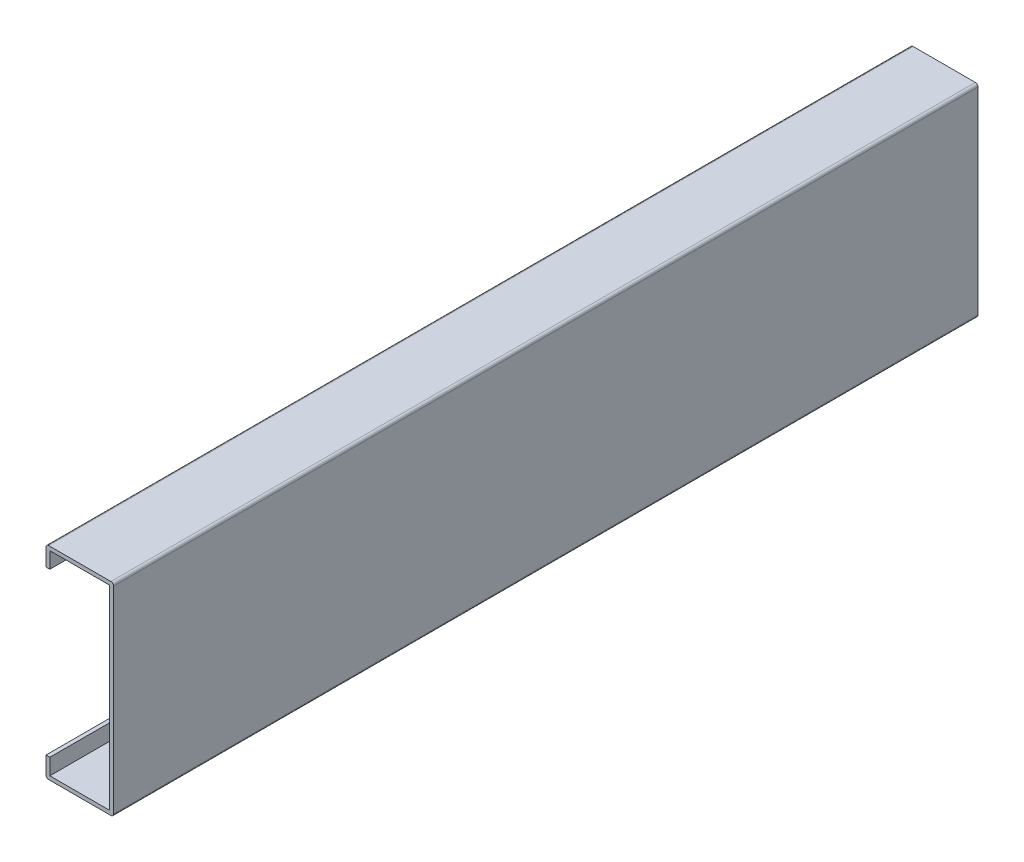
ISO-10303-21;
HEADER;
FILE_DESCRIPTION(('STEP AP214'),'2;1');
FILE_NAME('part.step','',(''),(''),'','','');
FILE_SCHEMA(('AUTOMOTIVE_DESIGN { 1 0 10303 214 1 1 1 1 }'));
ENDSEC;
DATA;
#1=APPLICATION_CONTEXT('core data for automotive mechanical design processes');
#2=APPLICATION_PROTOCOL_DEFINITION('international standard','automotive_design',2000,#1);
#3=PRODUCT_CONTEXT('',#1,'mechanical');
#4=PRODUCT('Part','Part','',(#3));
#5=PRODUCT_RELATED_PRODUCT_CATEGORY('part','',(#4));
#6=PRODUCT_DEFINITION_FORMATION('','',#4);
#7=PRODUCT_DEFINITION_CONTEXT('part definition',#1,'design');
#8=PRODUCT_DEFINITION('design','',#6,#7);
#9=PRODUCT_DEFINITION_SHAPE('','',#8);
#10=(LENGTH_UNIT() NAMED_UNIT(*) SI_UNIT(.MILLI.,.METRE.));
#11=(NAMED_UNIT(*) PLANE_ANGLE_UNIT() SI_UNIT($,.RADIAN.));
#12=(NAMED_UNIT(*) SI_UNIT($,.STERADIAN.) SOLID_ANGLE_UNIT());
#13=UNCERTAINTY_MEASURE_WITH_UNIT(LENGTH_MEASURE(1.E-05),#10,'distance_accuracy_value','');
#14=(GEOMETRIC_REPRESENTATION_CONTEXT(3) GLOBAL_UNCERTAINTY_ASSIGNED_CONTEXT((#13)) GLOBAL_UNIT_ASSIGNED_CONTEXT((#10,
#11,#12)) REPRESENTATION_CONTEXT('',''));
#15=CARTESIAN_POINT('',(0.,0.,0.));
#16=DIRECTION('',(0.,0.,1.));
#17=DIRECTION('',(1.,0.,0.));
#18=AXIS2_PLACEMENT_3D('',#15,#16,#17);
#19=CARTESIAN_POINT('',(0.,0.,650.));
#20=DIRECTION('',(1.,0.,0.));
#21=DIRECTION('',(0.,1.,0.));
#22=AXIS2_PLACEMENT_3D('',#19,#20,#21);
#23=PLANE('',#22);
#24=DIRECTION('',(0.,-1.,0.));
#25=VECTOR('',#24,1.);
#26=CARTESIAN_POINT('',(0.,0.,650.));
#27=LINE('',#26,#25);
#28=CARTESIAN_POINT('',(0.,-2.,650.));
#29=VERTEX_POINT('',#28);
#30=CARTESIAN_POINT('',(0.,-15.,650.));
#31=VERTEX_POINT('',#30);
#32=EDGE_CURVE('E147',#29,#31,#27,.T.);
#33=ORIENTED_EDGE('',*,*,#32,.F.);
#34=DIRECTION('',(0.,0.,-1.));
#35=VECTOR('',#34,1.);
#36=CARTESIAN_POINT('',(0.,-2.,650.));
#37=LINE('',#36,#35);
#38=CARTESIAN_POINT('',(0.,-2.,0.));
#39=VERTEX_POINT('',#38);
#40=EDGE_CURVE('E203',#29,#39,#37,.T.);
#41=ORIENTED_EDGE('',*,*,#40,.T.);
#42=DIRECTION('',(0.,-1.,0.));
#43=VECTOR('',#42,1.);
#44=CARTESIAN_POINT('',(0.,0.,0.));
#45=LINE('',#44,#43);
#46=CARTESIAN_POINT('',(0.,-15.,0.));
#47=VERTEX_POINT('',#46);
#48=EDGE_CURVE('E172',#39,#47,#45,.T.);
#49=ORIENTED_EDGE('',*,*,#48,.T.);
#50=DIRECTION('',(0.,0.,-1.));
#51=VECTOR('',#50,1.);
#52=CARTESIAN_POINT('',(0.,-15.,650.));
#53=LINE('',#52,#51);
#54=EDGE_CURVE('E165',#31,#47,#53,.T.);
#55=ORIENTED_EDGE('',*,*,#54,.F.);
#56=EDGE_LOOP('',(#33,#41,#49,#55));
#57=FACE_BOUND('',#56,.T.);
#58=ADVANCED_FACE('F35',(#57),#23,.F.);
#59=CARTESIAN_POINT('',(2.9,-15.,650.));
#60=DIRECTION('',(0.,1.,0.));
#61=DIRECTION('',(0.,0.,1.));
#62=AXIS2_PLACEMENT_3D('',#59,#60,#61);
#63=PLANE('',#62);
#64=DIRECTION('',(1.,0.,0.));
#65=VECTOR('',#64,1.);
#66=CARTESIAN_POINT('',(2.9,-15.,0.));
#67=LINE('',#66,#65);
#68=CARTESIAN_POINT('',(2.9,-15.,0.));
#69=VERTEX_POINT('',#68);
#70=EDGE_CURVE('E262',#47,#69,#67,.T.);
#71=ORIENTED_EDGE('',*,*,#70,.T.);
#72=DIRECTION('',(0.,0.,-1.));
#73=VECTOR('',#72,1.);
#74=CARTESIAN_POINT('',(2.9,-15.,650.));
#75=LINE('',#74,#73);
#76=CARTESIAN_POINT('',(2.9,-15.,650.));
#77=VERTEX_POINT('',#76);
#78=EDGE_CURVE('E167',#77,#69,#75,.T.);
#79=ORIENTED_EDGE('',*,*,#78,.F.);
#80=DIRECTION('',(1.,0.,0.));
#81=VECTOR('',#80,1.);
#82=CARTESIAN_POINT('',(2.9,-15.,650.));
#83=LINE('',#82,#81);
#84=EDGE_CURVE('E151',#31,#77,#83,.T.);
#85=ORIENTED_EDGE('',*,*,#84,.F.);
#86=ORIENTED_EDGE('',*,*,#54,.T.);
#87=EDGE_LOOP('',(#71,#79,#85,#86));
#88=FACE_BOUND('',#87,.T.);
#89=ADVANCED_FACE('F164',(#88),#63,.F.);
#90=CARTESIAN_POINT('',(2.9,-2.9,650.));
#91=DIRECTION('',(-1.,0.,0.));
#92=DIRECTION('',(0.,0.,1.));
#93=AXIS2_PLACEMENT_3D('',#90,#91,#92);
#94=PLANE('',#93);
#95=DIRECTION('',(0.,1.,0.));
#96=VECTOR('',#95,1.);
#97=CARTESIAN_POINT('',(2.9,-2.9,0.));
#98=LINE('',#97,#96);
#99=CARTESIAN_POINT('',(2.9,-2.9,0.));
#100=VERTEX_POINT('',#99);
#101=EDGE_CURVE('E256',#69,#100,#98,.T.);
#102=ORIENTED_EDGE('',*,*,#101,.T.);
#103=DIRECTION('',(0.,0.,-1.));
#104=VECTOR('',#103,1.);
#105=CARTESIAN_POINT('',(2.9,-2.9,650.));
#106=LINE('',#105,#104);
#107=CARTESIAN_POINT('',(2.9,-2.9,650.));
#108=VERTEX_POINT('',#107);
#109=EDGE_CURVE('E178',#108,#100,#106,.T.);
#110=ORIENTED_EDGE('',*,*,#109,.F.);
#111=DIRECTION('',(0.,1.,0.));
#112=VECTOR('',#111,1.);
#113=CARTESIAN_POINT('',(2.9,-2.9,650.));
#114=LINE('',#113,#112);
#115=EDGE_CURVE('E169',#77,#108,#114,.T.);
#116=ORIENTED_EDGE('',*,*,#115,.F.);
#117=ORIENTED_EDGE('',*,*,#78,.T.);
#118=EDGE_LOOP('',(#102,#110,#116,#117));
#119=FACE_BOUND('',#118,.T.);
#120=ADVANCED_FACE('F290',(#119),#94,.F.);
#121=CARTESIAN_POINT('',(2.9,-2.9,650.));
#122=DIRECTION('',(0.,1.,0.));
#123=DIRECTION('',(0.,0.,1.));
#124=AXIS2_PLACEMENT_3D('',#121,#122,#123);
#125=PLANE('',#124);
#126=DIRECTION('',(1.,0.,0.));
#127=VECTOR('',#126,1.);
#128=CARTESIAN_POINT('',(2.9,-2.9,0.));
#129=LINE('',#128,#127);
#130=CARTESIAN_POINT('',(47.9,-2.9,0.));
#131=VERTEX_POINT('',#130);
#132=EDGE_CURVE('E251',#100,#131,#129,.T.);
#133=ORIENTED_EDGE('',*,*,#132,.T.);
#134=DIRECTION('',(0.,0.,-1.));
#135=VECTOR('',#134,1.);
#136=CARTESIAN_POINT('',(47.9,-2.9,650.));
#137=LINE('',#136,#135);
#138=CARTESIAN_POINT('',(47.9,-2.9,650.));
#139=VERTEX_POINT('',#138);
#140=EDGE_CURVE('E242',#139,#131,#137,.T.);
#141=ORIENTED_EDGE('',*,*,#140,.F.);
#142=DIRECTION('',(1.,0.,0.));
#143=VECTOR('',#142,1.);
#144=CARTESIAN_POINT('',(2.9,-2.9,650.));
#145=LINE('',#144,#143);
#146=EDGE_CURVE('E252',#108,#139,#145,.T.);
#147=ORIENTED_EDGE('',*,*,#146,.F.);
#148=ORIENTED_EDGE('',*,*,#109,.T.);
#149=EDGE_LOOP('',(#133,#141,#147,#148));
#150=FACE_BOUND('',#149,.T.);
#151=ADVANCED_FACE('F249',(#150),#125,.F.);
#152=CARTESIAN_POINT('',(47.9,-2.9,650.));
#153=DIRECTION('',(1.,0.,0.));
#154=DIRECTION('',(0.,0.,-1.));
#155=AXIS2_PLACEMENT_3D('',#152,#153,#154);
#156=PLANE('',#155);
#157=DIRECTION('',(0.,-1.,0.));
#158=VECTOR('',#157,1.);
#159=CARTESIAN_POINT('',(47.9,-2.9,0.));
#160=LINE('',#159,#158);
#161=CARTESIAN_POINT('',(47.9,-149.5,0.));
#162=VERTEX_POINT('',#161);
#163=EDGE_CURVE('E258',#131,#162,#160,.T.);
#164=ORIENTED_EDGE('',*,*,#163,.T.);
#165=DIRECTION('',(0.,0.,-1.));
#166=VECTOR('',#165,1.);
#167=CARTESIAN_POINT('',(47.9,-149.5,650.));
#168=LINE('',#167,#166);
#169=CARTESIAN_POINT('',(47.9,-149.5,650.));
#170=VERTEX_POINT('',#169);
#171=EDGE_CURVE('E239',#170,#162,#168,.T.);
#172=ORIENTED_EDGE('',*,*,#171,.F.);
#173=DIRECTION('',(0.,-1.,0.));
#174=VECTOR('',#173,1.);
#175=CARTESIAN_POINT('',(47.9,-2.9,650.));
#176=LINE('',#175,#174);
#177=EDGE_CURVE('E292',#139,#170,#176,.T.);
#178=ORIENTED_EDGE('',*,*,#177,.F.);
#179=ORIENTED_EDGE('',*,*,#140,.T.);
#180=EDGE_LOOP('',(#164,#172,#178,#179));
#181=FACE_BOUND('',#180,.T.);
#182=ADVANCED_FACE('F307',(#181),#156,.F.);
#183=CARTESIAN_POINT('',(47.9,-149.5,650.));
#184=DIRECTION('',(0.,-1.,0.));
#185=DIRECTION('',(0.,0.,-1.));
#186=AXIS2_PLACEMENT_3D('',#183,#184,#185);
#187=PLANE('',#186);
#188=DIRECTION('',(-1.,0.,0.));
#189=VECTOR('',#188,1.);
#190=CARTESIAN_POINT('',(47.9,-149.5,0.));
#191=LINE('',#190,#189);
#192=CARTESIAN_POINT('',(2.9,-149.5,0.));
#193=VERTEX_POINT('',#192);
#194=EDGE_CURVE('E260',#162,#193,#191,.T.);
#195=ORIENTED_EDGE('',*,*,#194,.T.);
#196=DIRECTION('',(0.,0.,-1.));
#197=VECTOR('',#196,1.);
#198=CARTESIAN_POINT('',(2.9,-149.5,650.));
#199=LINE('',#198,#197);
#200=CARTESIAN_POINT('',(2.9,-149.5,650.));
#201=VERTEX_POINT('',#200);
#202=EDGE_CURVE('E236',#201,#193,#199,.T.);
#203=ORIENTED_EDGE('',*,*,#202,.F.);
#204=DIRECTION('',(-1.,0.,0.));
#205=VECTOR('',#204,1.);
#206=CARTESIAN_POINT('',(47.9,-149.5,650.));
#207=LINE('',#206,#205);
#208=EDGE_CURVE('E296',#170,#201,#207,.T.);
#209=ORIENTED_EDGE('',*,*,#208,.F.);
#210=ORIENTED_EDGE('',*,*,#171,.T.);
#211=EDGE_LOOP('',(#195,#203,#209,#210));
#212=FACE_BOUND('',#211,.T.);
#213=ADVANCED_FACE('F303',(#212),#187,.F.);
#214=CARTESIAN_POINT('',(2.9,-149.5,650.));
#215=DIRECTION('',(-1.,0.,0.));
#216=DIRECTION('',(0.,0.,1.));
#217=AXIS2_PLACEMENT_3D('',#214,#215,#216);
#218=PLANE('',#217);
#219=DIRECTION('',(0.,1.,0.));
#220=VECTOR('',#219,1.);
#221=CARTESIAN_POINT('',(2.9,-149.5,0.));
#222=LINE('',#221,#220);
#223=CARTESIAN_POINT('',(2.9,-137.4,0.));
#224=VERTEX_POINT('',#223);
#225=EDGE_CURVE('E267',#193,#224,#222,.T.);
#226=ORIENTED_EDGE('',*,*,#225,.T.);
#227=DIRECTION('',(0.,0.,-1.));
#228=VECTOR('',#227,1.);
#229=CARTESIAN_POINT('',(2.9,-137.4,650.));
#230=LINE('',#229,#228);
#231=CARTESIAN_POINT('',(2.9,-137.4,650.));
#232=VERTEX_POINT('',#231);
#233=EDGE_CURVE('E232',#232,#224,#230,.T.);
#234=ORIENTED_EDGE('',*,*,#233,.F.);
#235=DIRECTION('',(0.,1.,0.));
#236=VECTOR('',#235,1.);
#237=CARTESIAN_POINT('',(2.9,-149.5,650.));
#238=LINE('',#237,#236);
#239=EDGE_CURVE('E284',#201,#232,#238,.T.);
#240=ORIENTED_EDGE('',*,*,#239,.F.);
#241=ORIENTED_EDGE('',*,*,#202,.T.);
#242=EDGE_LOOP('',(#226,#234,#240,#241));
#243=FACE_BOUND('',#242,.T.);
#244=ADVANCED_FACE('F301',(#243),#218,.F.);
#245=CARTESIAN_POINT('',(2.9,-137.4,650.));
#246=DIRECTION('',(0.,-1.,0.));
#247=DIRECTION('',(0.,0.,-1.));
#248=AXIS2_PLACEMENT_3D('',#245,#246,#247);
#249=PLANE('',#248);
#250=DIRECTION('',(-1.,0.,0.));
#251=VECTOR('',#250,1.);
#252=CARTESIAN_POINT('',(2.9,-137.4,0.));
#253=LINE('',#252,#251);
#254=CARTESIAN_POINT('',(0.,-137.4,0.));
#255=VERTEX_POINT('',#254);
#256=EDGE_CURVE('E223',#224,#255,#253,.T.);
#257=ORIENTED_EDGE('',*,*,#256,.T.);
#258=DIRECTION('',(0.,0.,-1.));
#259=VECTOR('',#258,1.);
#260=CARTESIAN_POINT('',(0.,-137.4,650.));
#261=LINE('',#260,#259);
#262=CARTESIAN_POINT('',(0.,-137.4,650.));
#263=VERTEX_POINT('',#262);
#264=EDGE_CURVE('E229',#263,#255,#261,.T.);
#265=ORIENTED_EDGE('',*,*,#264,.F.);
#266=DIRECTION('',(-1.,0.,0.));
#267=VECTOR('',#266,1.);
#268=CARTESIAN_POINT('',(2.9,-137.4,650.));
#269=LINE('',#268,#267);
#270=EDGE_CURVE('E280',#232,#263,#269,.T.);
#271=ORIENTED_EDGE('',*,*,#270,.F.);
#272=ORIENTED_EDGE('',*,*,#233,.T.);
#273=EDGE_LOOP('',(#257,#265,#271,#272));
#274=FACE_BOUND('',#273,.T.);
#275=ADVANCED_FACE('F271',(#274),#249,.F.);
#276=CARTESIAN_POINT('',(0.,-152.4,650.));
#277=DIRECTION('',(1.,0.,0.));
#278=DIRECTION('',(0.,0.,-1.));
#279=AXIS2_PLACEMENT_3D('',#276,#277,#278);
#280=PLANE('',#279);
#281=DIRECTION('',(0.,-1.,0.));
#282=VECTOR('',#281,1.);
#283=CARTESIAN_POINT('',(0.,-152.4,0.));
#284=LINE('',#283,#282);
#285=CARTESIAN_POINT('',(0.,-150.4,0.));
#286=VERTEX_POINT('',#285);
#287=EDGE_CURVE('E219',#255,#286,#284,.T.);
#288=ORIENTED_EDGE('',*,*,#287,.T.);
#289=DIRECTION('',(0.,0.,-1.));
#290=VECTOR('',#289,1.);
#291=CARTESIAN_POINT('',(0.,-150.4,650.));
#292=LINE('',#291,#290);
#293=CARTESIAN_POINT('',(0.,-150.4,650.));
#294=VERTEX_POINT('',#293);
#295=EDGE_CURVE('E11',#286,#294,#292,.F.);
#296=ORIENTED_EDGE('',*,*,#295,.T.);
#297=DIRECTION('',(0.,-1.,0.));
#298=VECTOR('',#297,1.);
#299=CARTESIAN_POINT('',(0.,-152.4,650.));
#300=LINE('',#299,#298);
#301=EDGE_CURVE('E279',#263,#294,#300,.T.);
#302=ORIENTED_EDGE('',*,*,#301,.F.);
#303=ORIENTED_EDGE('',*,*,#264,.T.);
#304=EDGE_LOOP('',(#288,#296,#302,#303));
#305=FACE_BOUND('',#304,.T.);
#306=ADVANCED_FACE('F277',(#305),#280,.F.);
#307=CARTESIAN_POINT('',(50.8,-152.4,650.));
#308=DIRECTION('',(0.,1.,0.));
#309=DIRECTION('',(0.,0.,1.));
#310=AXIS2_PLACEMENT_3D('',#307,#308,#309);
#311=PLANE('',#310);
#312=DIRECTION('',(1.,0.,0.));
#313=VECTOR('',#312,1.);
#314=CARTESIAN_POINT('',(50.8,-152.4,650.));
#315=LINE('',#314,#313);
#316=CARTESIAN_POINT('',(2.,-152.4,650.));
#317=VERTEX_POINT('',#316);
#318=CARTESIAN_POINT('',(48.8,-152.4,650.));
#319=VERTEX_POINT('',#318);
#320=EDGE_CURVE('E210',#317,#319,#315,.T.);
#321=ORIENTED_EDGE('',*,*,#320,.F.);
#322=DIRECTION('',(0.,0.,-1.));
#323=VECTOR('',#322,1.);
#324=CARTESIAN_POINT('',(2.,-152.4,650.));
#325=LINE('',#324,#323);
#326=CARTESIAN_POINT('',(2.,-152.4,0.));
#327=VERTEX_POINT('',#326);
#328=EDGE_CURVE('E43',#317,#327,#325,.T.);
#329=ORIENTED_EDGE('',*,*,#328,.T.);
#330=DIRECTION('',(1.,0.,0.));
#331=VECTOR('',#330,1.);
#332=CARTESIAN_POINT('',(50.8,-152.4,0.));
#333=LINE('',#332,#331);
#334=CARTESIAN_POINT('',(48.8,-152.4,0.));
#335=VERTEX_POINT('',#334);
#336=EDGE_CURVE('E209',#327,#335,#333,.T.);
#337=ORIENTED_EDGE('',*,*,#336,.T.);
#338=DIRECTION('',(0.,0.,-1.));
#339=VECTOR('',#338,1.);
#340=CARTESIAN_POINT('',(48.8,-152.4,650.));
#341=LINE('',#340,#339);
#342=EDGE_CURVE('E50',#335,#319,#341,.F.);
#343=ORIENTED_EDGE('',*,*,#342,.T.);
#344=EDGE_LOOP('',(#321,#329,#337,#343));
#345=FACE_BOUND('',#344,.T.);
#346=ADVANCED_FACE('F208',(#345),#311,.F.);
#347=CARTESIAN_POINT('',(50.8,0.,650.));
#348=DIRECTION('',(-1.,0.,0.));
#349=DIRECTION('',(0.,-1.,0.));
#350=AXIS2_PLACEMENT_3D('',#347,#348,#349);
#351=PLANE('',#350);
#352=DIRECTION('',(0.,1.,0.));
#353=VECTOR('',#352,1.);
#354=CARTESIAN_POINT('',(50.8,0.,0.));
#355=LINE('',#354,#353);
#356=CARTESIAN_POINT('',(50.8,-150.4,0.));
#357=VERTEX_POINT('',#356);
#358=CARTESIAN_POINT('',(50.8,-2.,0.));
#359=VERTEX_POINT('',#358);
#360=EDGE_CURVE('E218',#357,#359,#355,.T.);
#361=ORIENTED_EDGE('',*,*,#360,.T.);
#362=DIRECTION('',(0.,0.,-1.));
#363=VECTOR('',#362,1.);
#364=CARTESIAN_POINT('',(50.8,-2.,650.));
#365=LINE('',#364,#363);
#366=CARTESIAN_POINT('',(50.8,-2.,650.));
#367=VERTEX_POINT('',#366);
#368=EDGE_CURVE('E195',#359,#367,#365,.F.);
#369=ORIENTED_EDGE('',*,*,#368,.T.);
#370=DIRECTION('',(0.,1.,0.));
#371=VECTOR('',#370,1.);
#372=CARTESIAN_POINT('',(50.8,0.,650.));
#373=LINE('',#372,#371);
#374=CARTESIAN_POINT('',(50.8,-150.4,650.));
#375=VERTEX_POINT('',#374);
#376=EDGE_CURVE('E282',#375,#367,#373,.T.);
#377=ORIENTED_EDGE('',*,*,#376,.F.);
#378=DIRECTION('',(0.,0.,-1.));
#379=VECTOR('',#378,1.);
#380=CARTESIAN_POINT('',(50.8,-150.4,650.));
#381=LINE('',#380,#379);
#382=EDGE_CURVE('E192',#375,#357,#381,.T.);
#383=ORIENTED_EDGE('',*,*,#382,.T.);
#384=EDGE_LOOP('',(#361,#369,#377,#383));
#385=FACE_BOUND('',#384,.T.);
#386=ADVANCED_FACE('F344',(#385),#351,.F.);
#387=CARTESIAN_POINT('',(0.,0.,650.));
#388=DIRECTION('',(0.,-1.,0.));
#389=DIRECTION('',(0.,0.,-1.));
#390=AXIS2_PLACEMENT_3D('',#387,#388,#389);
#391=PLANE('',#390);
#392=DIRECTION('',(-1.,0.,0.));
#393=VECTOR('',#392,1.);
#394=CARTESIAN_POINT('',(0.,0.,650.));
#395=LINE('',#394,#393);
#396=CARTESIAN_POINT('',(48.8,0.,650.));
#397=VERTEX_POINT('',#396);
#398=CARTESIAN_POINT('',(2.,0.,650.));
#399=VERTEX_POINT('',#398);
#400=EDGE_CURVE('E233',#397,#399,#395,.T.);
#401=ORIENTED_EDGE('',*,*,#400,.F.);
#402=DIRECTION('',(0.,0.,-1.));
#403=VECTOR('',#402,1.);
#404=CARTESIAN_POINT('',(48.8,0.,650.));
#405=LINE('',#404,#403);
#406=CARTESIAN_POINT('',(48.8,0.,0.));
#407=VERTEX_POINT('',#406);
#408=EDGE_CURVE('E176',#397,#407,#405,.T.);
#409=ORIENTED_EDGE('',*,*,#408,.T.);
#410=DIRECTION('',(-1.,0.,0.));
#411=VECTOR('',#410,1.);
#412=CARTESIAN_POINT('',(0.,0.,0.));
#413=LINE('',#412,#411);
#414=CARTESIAN_POINT('',(2.,0.,0.));
#415=VERTEX_POINT('',#414);
#416=EDGE_CURVE('E160',#407,#415,#413,.T.);
#417=ORIENTED_EDGE('',*,*,#416,.T.);
#418=DIRECTION('',(0.,0.,-1.));
#419=VECTOR('',#418,1.);
#420=CARTESIAN_POINT('',(2.,0.,650.));
#421=LINE('',#420,#419);
#422=EDGE_CURVE('E174',#415,#399,#421,.F.);
#423=ORIENTED_EDGE('',*,*,#422,.T.);
#424=EDGE_LOOP('',(#401,#409,#417,#423));
#425=FACE_BOUND('',#424,.T.);
#426=ADVANCED_FACE('F349',(#425),#391,.F.);
#427=CARTESIAN_POINT('',(0.,0.,650.));
#428=DIRECTION('',(0.,0.,-1.));
#429=DIRECTION('',(-1.,0.,0.));
#430=AXIS2_PLACEMENT_3D('',#427,#428,#429);
#431=PLANE('',#430);
#432=ORIENTED_EDGE('',*,*,#376,.T.);
#433=CARTESIAN_POINT('',(48.8,-2.,650.));
#434=DIRECTION('',(0.,0.,-1.));
#435=DIRECTION('',(-1.,0.,0.));
#436=AXIS2_PLACEMENT_3D('',#433,#434,#435);
#437=CIRCLE('',#436,2.);
#438=EDGE_CURVE('E201',#367,#397,#437,.F.);
#439=ORIENTED_EDGE('',*,*,#438,.T.);
#440=ORIENTED_EDGE('',*,*,#400,.T.);
#441=CARTESIAN_POINT('',(2.,-2.,650.));
#442=DIRECTION('',(0.,0.,-1.));
#443=DIRECTION('',(-1.,0.,0.));
#444=AXIS2_PLACEMENT_3D('',#441,#442,#443);
#445=CIRCLE('',#444,2.);
#446=EDGE_CURVE('E155',#399,#29,#445,.F.);
#447=ORIENTED_EDGE('',*,*,#446,.T.);
#448=ORIENTED_EDGE('',*,*,#32,.T.);
#449=ORIENTED_EDGE('',*,*,#84,.T.);
#450=ORIENTED_EDGE('',*,*,#115,.T.);
#451=ORIENTED_EDGE('',*,*,#146,.T.);
#452=ORIENTED_EDGE('',*,*,#177,.T.);
#453=ORIENTED_EDGE('',*,*,#208,.T.);
#454=ORIENTED_EDGE('',*,*,#239,.T.);
#455=ORIENTED_EDGE('',*,*,#270,.T.);
#456=ORIENTED_EDGE('',*,*,#301,.T.);
#457=CARTESIAN_POINT('',(2.,-150.4,650.));
#458=DIRECTION('',(0.,0.,-1.));
#459=DIRECTION('',(-1.,0.,0.));
#460=AXIS2_PLACEMENT_3D('',#457,#458,#459);
#461=CIRCLE('',#460,2.);
#462=EDGE_CURVE('E57',#294,#317,#461,.F.);
#463=ORIENTED_EDGE('',*,*,#462,.T.);
#464=ORIENTED_EDGE('',*,*,#320,.T.);
#465=CARTESIAN_POINT('',(48.8,-150.4,650.));
#466=DIRECTION('',(0.,0.,-1.));
#467=DIRECTION('',(-1.,0.,0.));
#468=AXIS2_PLACEMENT_3D('',#465,#466,#467);
#469=CIRCLE('',#468,2.);
#470=EDGE_CURVE('E197',#319,#375,#469,.F.);
#471=ORIENTED_EDGE('',*,*,#470,.T.);
#472=EDGE_LOOP('',(#432,#439,#440,#447,#448,#449,#450,#451,#452,#453,#454,#455,#456,#463,#464,#471));
#473=FACE_BOUND('',#472,.T.);
#474=ADVANCED_FACE('F150',(#473),#431,.F.);
#475=CARTESIAN_POINT('',(0.,0.,0.));
#476=DIRECTION('',(0.,0.,-1.));
#477=DIRECTION('',(-1.,0.,0.));
#478=AXIS2_PLACEMENT_3D('',#475,#476,#477);
#479=PLANE('',#478);
#480=ORIENTED_EDGE('',*,*,#416,.F.);
#481=CARTESIAN_POINT('',(48.8,-2.,0.));
#482=DIRECTION('',(0.,0.,-1.));
#483=DIRECTION('',(-1.,0.,0.));
#484=AXIS2_PLACEMENT_3D('',#481,#482,#483);
#485=CIRCLE('',#484,2.);
#486=EDGE_CURVE('E190',#407,#359,#485,.T.);
#487=ORIENTED_EDGE('',*,*,#486,.T.);
#488=ORIENTED_EDGE('',*,*,#360,.F.);
#489=CARTESIAN_POINT('',(48.8,-150.4,0.));
#490=DIRECTION('',(0.,0.,-1.));
#491=DIRECTION('',(-1.,0.,0.));
#492=AXIS2_PLACEMENT_3D('',#489,#490,#491);
#493=CIRCLE('',#492,2.);
#494=EDGE_CURVE('E184',#357,#335,#493,.T.);
#495=ORIENTED_EDGE('',*,*,#494,.T.);
#496=ORIENTED_EDGE('',*,*,#336,.F.);
#497=CARTESIAN_POINT('',(2.,-150.4,0.));
#498=DIRECTION('',(0.,0.,-1.));
#499=DIRECTION('',(-1.,0.,0.));
#500=AXIS2_PLACEMENT_3D('',#497,#498,#499);
#501=CIRCLE('',#500,2.);
#502=EDGE_CURVE('E186',#327,#286,#501,.T.);
#503=ORIENTED_EDGE('',*,*,#502,.T.);
#504=ORIENTED_EDGE('',*,*,#287,.F.);
#505=ORIENTED_EDGE('',*,*,#256,.F.);
#506=ORIENTED_EDGE('',*,*,#225,.F.);
#507=ORIENTED_EDGE('',*,*,#194,.F.);
#508=ORIENTED_EDGE('',*,*,#163,.F.);
#509=ORIENTED_EDGE('',*,*,#132,.F.);
#510=ORIENTED_EDGE('',*,*,#101,.F.);
#511=ORIENTED_EDGE('',*,*,#70,.F.);
#512=ORIENTED_EDGE('',*,*,#48,.F.);
#513=CARTESIAN_POINT('',(2.,-2.,0.));
#514=DIRECTION('',(0.,0.,-1.));
#515=DIRECTION('',(-1.,0.,0.));
#516=AXIS2_PLACEMENT_3D('',#513,#514,#515);
#517=CIRCLE('',#516,2.);
#518=EDGE_CURVE('E188',#39,#415,#517,.T.);
#519=ORIENTED_EDGE('',*,*,#518,.T.);
#520=EDGE_LOOP('',(#480,#487,#488,#495,#496,#503,#504,#505,#506,#507,#508,#509,#510,#511,#512,#519));
#521=FACE_BOUND('',#520,.T.);
#522=ADVANCED_FACE('F214',(#521),#479,.T.);
#523=CARTESIAN_POINT('',(48.8,-2.,650.));
#524=DIRECTION('',(0.,0.,-1.));
#525=DIRECTION('',(-1.,0.,0.));
#526=AXIS2_PLACEMENT_3D('',#523,#524,#525);
#527=CYLINDRICAL_SURFACE('',#526,2.);
#528=ORIENTED_EDGE('',*,*,#438,.F.);
#529=ORIENTED_EDGE('',*,*,#368,.F.);
#530=ORIENTED_EDGE('',*,*,#486,.F.);
#531=ORIENTED_EDGE('',*,*,#408,.F.);
#532=EDGE_LOOP('',(#528,#529,#530,#531));
#533=FACE_BOUND('',#532,.T.);
#534=ADVANCED_FACE('F324',(#533),#527,.T.);
#535=CARTESIAN_POINT('',(2.,-2.,650.));
#536=DIRECTION('',(0.,0.,-1.));
#537=DIRECTION('',(-1.,0.,0.));
#538=AXIS2_PLACEMENT_3D('',#535,#536,#537);
#539=CYLINDRICAL_SURFACE('',#538,2.);
#540=ORIENTED_EDGE('',*,*,#446,.F.);
#541=ORIENTED_EDGE('',*,*,#422,.F.);
#542=ORIENTED_EDGE('',*,*,#518,.F.);
#543=ORIENTED_EDGE('',*,*,#40,.F.);
#544=EDGE_LOOP('',(#540,#541,#542,#543));
#545=FACE_BOUND('',#544,.T.);
#546=ADVANCED_FACE('F327',(#545),#539,.T.);
#547=CARTESIAN_POINT('',(2.,-150.4,650.));
#548=DIRECTION('',(0.,0.,-1.));
#549=DIRECTION('',(-1.,0.,0.));
#550=AXIS2_PLACEMENT_3D('',#547,#548,#549);
#551=CYLINDRICAL_SURFACE('',#550,2.);
#552=ORIENTED_EDGE('',*,*,#462,.F.);
#553=ORIENTED_EDGE('',*,*,#295,.F.);
#554=ORIENTED_EDGE('',*,*,#502,.F.);
#555=ORIENTED_EDGE('',*,*,#328,.F.);
#556=EDGE_LOOP('',(#552,#553,#554,#555));
#557=FACE_BOUND('',#556,.T.);
#558=ADVANCED_FACE('F330',(#557),#551,.T.);
#559=CARTESIAN_POINT('',(48.8,-150.4,650.));
#560=DIRECTION('',(0.,0.,-1.));
#561=DIRECTION('',(-1.,0.,0.));
#562=AXIS2_PLACEMENT_3D('',#559,#560,#561);
#563=CYLINDRICAL_SURFACE('',#562,2.);
#564=ORIENTED_EDGE('',*,*,#470,.F.);
#565=ORIENTED_EDGE('',*,*,#342,.F.);
#566=ORIENTED_EDGE('',*,*,#494,.F.);
#567=ORIENTED_EDGE('',*,*,#382,.F.);
#568=EDGE_LOOP('',(#564,#565,#566,#567));
#569=FACE_BOUND('',#568,.T.);
#570=ADVANCED_FACE('F37',(#569),#563,.T.);
#571=CLOSED_SHELL('',(#58,#89,#120,#151,#182,#213,#244,#275,#306,#346,#386,#426,#474,#522,#534,
#546,#558,#570));
#572=MANIFOLD_SOLID_BREP('B2',#571);
#573=ADVANCED_BREP_SHAPE_REPRESENTATION('',(#18,#572),#14);
#574=SHAPE_DEFINITION_REPRESENTATION(#9,#573);
ENDSEC;
END-ISO-10303-21;
